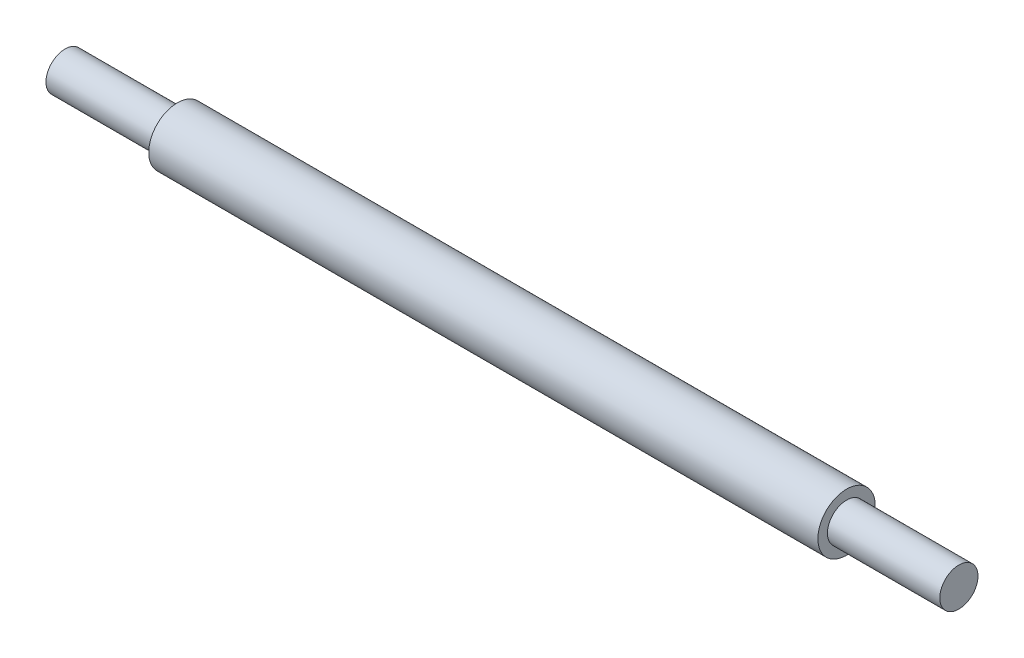
ISO-10303-21;
HEADER;
FILE_DESCRIPTION(('STEP AP214'),'2;1');
FILE_NAME('part.step','',(''),(''),'','','');
FILE_SCHEMA(('AUTOMOTIVE_DESIGN { 1 0 10303 214 1 1 1 1 }'));
ENDSEC;
DATA;
#1=APPLICATION_CONTEXT('core data for automotive mechanical design processes');
#2=APPLICATION_PROTOCOL_DEFINITION('international standard','automotive_design',2000,#1);
#3=PRODUCT_CONTEXT('',#1,'mechanical');
#4=PRODUCT('Part','Part','',(#3));
#5=PRODUCT_RELATED_PRODUCT_CATEGORY('part','',(#4));
#6=PRODUCT_DEFINITION_FORMATION('','',#4);
#7=PRODUCT_DEFINITION_CONTEXT('part definition',#1,'design');
#8=PRODUCT_DEFINITION('design','',#6,#7);
#9=PRODUCT_DEFINITION_SHAPE('','',#8);
#10=(LENGTH_UNIT() NAMED_UNIT(*) SI_UNIT(.MILLI.,.METRE.));
#11=(NAMED_UNIT(*) PLANE_ANGLE_UNIT() SI_UNIT($,.RADIAN.));
#12=(NAMED_UNIT(*) SI_UNIT($,.STERADIAN.) SOLID_ANGLE_UNIT());
#13=UNCERTAINTY_MEASURE_WITH_UNIT(LENGTH_MEASURE(1.E-05),#10,'distance_accuracy_value','');
#14=(GEOMETRIC_REPRESENTATION_CONTEXT(3) GLOBAL_UNCERTAINTY_ASSIGNED_CONTEXT((#13)) GLOBAL_UNIT_ASSIGNED_CONTEXT((#10,
#11,#12)) REPRESENTATION_CONTEXT('',''));
#15=CARTESIAN_POINT('',(0.,0.,0.));
#16=DIRECTION('',(0.,0.,1.));
#17=DIRECTION('',(1.,0.,0.));
#18=AXIS2_PLACEMENT_3D('',#15,#16,#17);
#19=CARTESIAN_POINT('',(-35.,0.,0.));
#20=DIRECTION('',(1.,0.,0.));
#21=DIRECTION('',(0.,0.,-1.));
#22=AXIS2_PLACEMENT_3D('',#19,#20,#21);
#23=CYLINDRICAL_SURFACE('',#22,3.);
#24=CARTESIAN_POINT('',(-35.,0.,0.));
#25=DIRECTION('',(1.,0.,0.));
#26=DIRECTION('',(0.,0.,-1.));
#27=AXIS2_PLACEMENT_3D('',#24,#25,#26);
#28=CIRCLE('',#27,3.);
#29=CARTESIAN_POINT('',(-35.,0.,-3.));
#30=VERTEX_POINT('',#29);
#31=EDGE_CURVE('E48',#30,#30,#28,.T.);
#32=ORIENTED_EDGE('',*,*,#31,.T.);
#33=EDGE_LOOP('',(#32));
#34=FACE_BOUND('',#33,.T.);
#35=CARTESIAN_POINT('',(35.,0.,0.));
#36=DIRECTION('',(1.,0.,0.));
#37=DIRECTION('',(0.,0.,-1.));
#38=AXIS2_PLACEMENT_3D('',#35,#36,#37);
#39=CIRCLE('',#38,3.);
#40=CARTESIAN_POINT('',(35.,0.,-3.));
#41=VERTEX_POINT('',#40);
#42=EDGE_CURVE('E53',#41,#41,#39,.T.);
#43=ORIENTED_EDGE('',*,*,#42,.F.);
#44=EDGE_LOOP('',(#43));
#45=FACE_BOUND('',#44,.T.);
#46=ADVANCED_FACE('F41',(#34,#45),#23,.T.);
#47=CARTESIAN_POINT('',(-35.,0.,0.));
#48=DIRECTION('',(1.,0.,0.));
#49=DIRECTION('',(0.,0.,-1.));
#50=AXIS2_PLACEMENT_3D('',#47,#48,#49);
#51=PLANE('',#50);
#52=CARTESIAN_POINT('',(-35.,0.,0.));
#53=DIRECTION('',(1.,0.,0.));
#54=DIRECTION('',(0.,0.,-1.));
#55=AXIS2_PLACEMENT_3D('',#52,#53,#54);
#56=CIRCLE('',#55,2.);
#57=CARTESIAN_POINT('',(-35.,0.,-2.));
#58=VERTEX_POINT('',#57);
#59=EDGE_CURVE('E58',#58,#58,#56,.T.);
#60=ORIENTED_EDGE('',*,*,#59,.T.);
#61=EDGE_LOOP('',(#60));
#62=FACE_BOUND('',#61,.T.);
#63=ORIENTED_EDGE('',*,*,#31,.F.);
#64=EDGE_LOOP('',(#63));
#65=FACE_BOUND('',#64,.T.);
#66=ADVANCED_FACE('F90',(#62,#65),#51,.F.);
#67=CARTESIAN_POINT('',(35.,0.,0.));
#68=DIRECTION('',(1.,0.,0.));
#69=DIRECTION('',(0.,0.,-1.));
#70=AXIS2_PLACEMENT_3D('',#67,#68,#69);
#71=PLANE('',#70);
#72=CARTESIAN_POINT('',(35.,0.,0.));
#73=DIRECTION('',(1.,0.,0.));
#74=DIRECTION('',(0.,0.,-1.));
#75=AXIS2_PLACEMENT_3D('',#72,#73,#74);
#76=CIRCLE('',#75,2.);
#77=CARTESIAN_POINT('',(35.,0.,-2.));
#78=VERTEX_POINT('',#77);
#79=EDGE_CURVE('E10',#78,#78,#76,.T.);
#80=ORIENTED_EDGE('',*,*,#79,.F.);
#81=EDGE_LOOP('',(#80));
#82=FACE_BOUND('',#81,.T.);
#83=ORIENTED_EDGE('',*,*,#42,.T.);
#84=EDGE_LOOP('',(#83));
#85=FACE_BOUND('',#84,.T.);
#86=ADVANCED_FACE('F85',(#82,#85),#71,.T.);
#87=CARTESIAN_POINT('',(46.75,0.,0.));
#88=DIRECTION('',(1.,0.,0.));
#89=DIRECTION('',(0.,0.,-1.));
#90=AXIS2_PLACEMENT_3D('',#87,#88,#89);
#91=PLANE('',#90);
#92=CARTESIAN_POINT('',(46.75,0.,0.));
#93=DIRECTION('',(1.,0.,0.));
#94=DIRECTION('',(0.,0.,-1.));
#95=AXIS2_PLACEMENT_3D('',#92,#93,#94);
#96=CIRCLE('',#95,2.);
#97=CARTESIAN_POINT('',(46.75,0.,-2.));
#98=VERTEX_POINT('',#97);
#99=EDGE_CURVE('E68',#98,#98,#96,.T.);
#100=ORIENTED_EDGE('',*,*,#99,.T.);
#101=EDGE_LOOP('',(#100));
#102=FACE_BOUND('',#101,.T.);
#103=ADVANCED_FACE('F73',(#102),#91,.T.);
#104=CARTESIAN_POINT('',(-46.75,0.,0.));
#105=DIRECTION('',(1.,0.,0.));
#106=DIRECTION('',(0.,0.,-1.));
#107=AXIS2_PLACEMENT_3D('',#104,#105,#106);
#108=CYLINDRICAL_SURFACE('',#107,2.);
#109=ORIENTED_EDGE('',*,*,#79,.T.);
#110=EDGE_LOOP('',(#109));
#111=FACE_BOUND('',#110,.T.);
#112=ORIENTED_EDGE('',*,*,#99,.F.);
#113=EDGE_LOOP('',(#112));
#114=FACE_BOUND('',#113,.T.);
#115=ADVANCED_FACE('F75',(#111,#114),#108,.T.);
#116=CARTESIAN_POINT('',(-46.75,0.,0.));
#117=DIRECTION('',(1.,0.,0.));
#118=DIRECTION('',(0.,0.,-1.));
#119=AXIS2_PLACEMENT_3D('',#116,#117,#118);
#120=CIRCLE('',#119,2.);
#121=CARTESIAN_POINT('',(-46.75,0.,-2.));
#122=VERTEX_POINT('',#121);
#123=EDGE_CURVE('E64',#122,#122,#120,.T.);
#124=ORIENTED_EDGE('',*,*,#123,.T.);
#125=EDGE_LOOP('',(#124));
#126=FACE_BOUND('',#125,.T.);
#127=ORIENTED_EDGE('',*,*,#59,.F.);
#128=EDGE_LOOP('',(#127));
#129=FACE_BOUND('',#128,.T.);
#130=ADVANCED_FACE('F77',(#126,#129),#108,.T.);
#131=CARTESIAN_POINT('',(-46.75,0.,0.));
#132=DIRECTION('',(1.,0.,0.));
#133=DIRECTION('',(0.,0.,-1.));
#134=AXIS2_PLACEMENT_3D('',#131,#132,#133);
#135=PLANE('',#134);
#136=ORIENTED_EDGE('',*,*,#123,.F.);
#137=EDGE_LOOP('',(#136));
#138=FACE_BOUND('',#137,.T.);
#139=ADVANCED_FACE('F83',(#138),#135,.F.);
#140=CLOSED_SHELL('',(#46,#66,#86,#103,#115,#130,#139));
#141=MANIFOLD_SOLID_BREP('B2',#140);
#142=ADVANCED_BREP_SHAPE_REPRESENTATION('',(#18,#141),#14);
#143=SHAPE_DEFINITION_REPRESENTATION(#9,#142);
ENDSEC;
END-ISO-10303-21;
